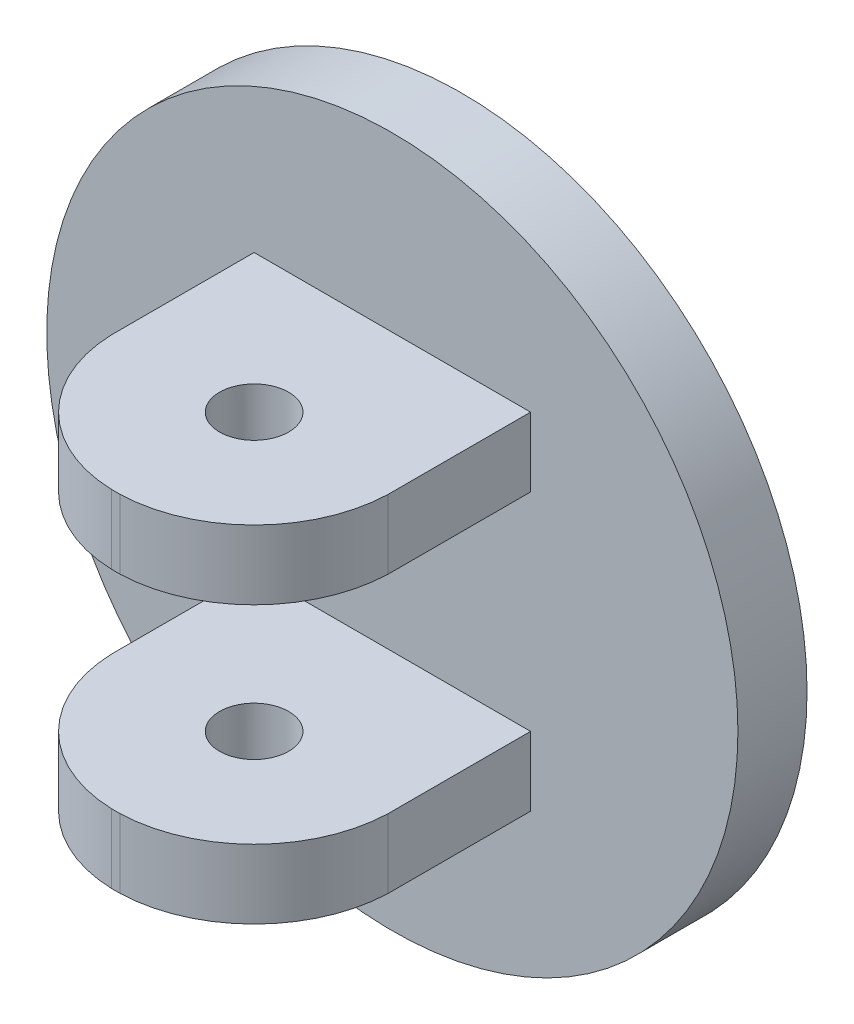
ISO-10303-21;
HEADER;
FILE_DESCRIPTION(('STEP AP214'),'2;1');
FILE_NAME('part.step','',(''),(''),'','','');
FILE_SCHEMA(('AUTOMOTIVE_DESIGN { 1 0 10303 214 1 1 1 1 }'));
ENDSEC;
DATA;
#1=APPLICATION_CONTEXT('core data for automotive mechanical design processes');
#2=APPLICATION_PROTOCOL_DEFINITION('international standard','automotive_design',2000,#1);
#3=PRODUCT_CONTEXT('',#1,'mechanical');
#4=PRODUCT('Part','Part','',(#3));
#5=PRODUCT_RELATED_PRODUCT_CATEGORY('part','',(#4));
#6=PRODUCT_DEFINITION_FORMATION('','',#4);
#7=PRODUCT_DEFINITION_CONTEXT('part definition',#1,'design');
#8=PRODUCT_DEFINITION('design','',#6,#7);
#9=PRODUCT_DEFINITION_SHAPE('','',#8);
#10=(LENGTH_UNIT() NAMED_UNIT(*) SI_UNIT(.MILLI.,.METRE.));
#11=(NAMED_UNIT(*) PLANE_ANGLE_UNIT() SI_UNIT($,.RADIAN.));
#12=(NAMED_UNIT(*) SI_UNIT($,.STERADIAN.) SOLID_ANGLE_UNIT());
#13=UNCERTAINTY_MEASURE_WITH_UNIT(LENGTH_MEASURE(1.E-05),#10,'distance_accuracy_value','');
#14=(GEOMETRIC_REPRESENTATION_CONTEXT(3) GLOBAL_UNCERTAINTY_ASSIGNED_CONTEXT((#13)) GLOBAL_UNIT_ASSIGNED_CONTEXT((#10,
#11,#12)) REPRESENTATION_CONTEXT('',''));
#15=CARTESIAN_POINT('',(0.,0.,0.));
#16=DIRECTION('',(0.,0.,1.));
#17=DIRECTION('',(1.,0.,0.));
#18=AXIS2_PLACEMENT_3D('',#15,#16,#17);
#19=CARTESIAN_POINT('',(20.,15.,50.));
#20=DIRECTION('',(-1.,0.,0.));
#21=DIRECTION('',(0.,0.,1.));
#22=AXIS2_PLACEMENT_3D('',#19,#20,#21);
#23=PLANE('',#22);
#24=DIRECTION('',(0.,1.,0.));
#25=VECTOR('',#24,1.);
#26=CARTESIAN_POINT('',(20.,15.,10.));
#27=LINE('',#26,#25);
#28=CARTESIAN_POINT('',(20.,15.,10.));
#29=VERTEX_POINT('',#28);
#30=CARTESIAN_POINT('',(20.,25.,10.));
#31=VERTEX_POINT('',#30);
#32=EDGE_CURVE('E164',#29,#31,#27,.T.);
#33=ORIENTED_EDGE('',*,*,#32,.T.);
#34=DIRECTION('',(0.,0.,-1.));
#35=VECTOR('',#34,1.);
#36=CARTESIAN_POINT('',(20.,25.,50.));
#37=LINE('',#36,#35);
#38=CARTESIAN_POINT('',(20.,25.,30.622391971047));
#39=VERTEX_POINT('',#38);
#40=EDGE_CURVE('E202',#39,#31,#37,.T.);
#41=ORIENTED_EDGE('',*,*,#40,.F.);
#42=DIRECTION('',(0.,1.,0.));
#43=VECTOR('',#42,1.);
#44=CARTESIAN_POINT('',(20.,-76.,30.622391971047));
#45=LINE('',#44,#43);
#46=CARTESIAN_POINT('',(20.,15.,30.622391971047));
#47=VERTEX_POINT('',#46);
#48=EDGE_CURVE('E246',#47,#39,#45,.T.);
#49=ORIENTED_EDGE('',*,*,#48,.F.);
#50=DIRECTION('',(0.,0.,-1.));
#51=VECTOR('',#50,1.);
#52=CARTESIAN_POINT('',(20.,15.,50.));
#53=LINE('',#52,#51);
#54=EDGE_CURVE('E179',#47,#29,#53,.T.);
#55=ORIENTED_EDGE('',*,*,#54,.T.);
#56=EDGE_LOOP('',(#33,#41,#49,#55));
#57=FACE_BOUND('',#56,.T.);
#58=ADVANCED_FACE('F39',(#57),#23,.F.);
#59=CARTESIAN_POINT('',(0.,25.,50.));
#60=DIRECTION('',(0.,-1.,0.));
#61=DIRECTION('',(1.,0.,0.));
#62=AXIS2_PLACEMENT_3D('',#59,#60,#61);
#63=PLANE('',#62);
#64=CARTESIAN_POINT('',(0.,25.,30.));
#65=DIRECTION('',(0.,-1.,0.));
#66=DIRECTION('',(1.,0.,0.));
#67=AXIS2_PLACEMENT_3D('',#64,#65,#66);
#68=CIRCLE('',#67,5.);
#69=CARTESIAN_POINT('',(5.,25.,30.));
#70=VERTEX_POINT('',#69);
#71=EDGE_CURVE('E259',#70,#70,#68,.F.);
#72=ORIENTED_EDGE('',*,*,#71,.F.);
#73=EDGE_LOOP('',(#72));
#74=FACE_BOUND('',#73,.T.);
#75=CARTESIAN_POINT('',(0.,25.,30.));
#76=DIRECTION('',(0.,-1.,0.));
#77=DIRECTION('',(1.,0.,0.));
#78=AXIS2_PLACEMENT_3D('',#75,#76,#77);
#79=CIRCLE('',#78,20.0096819506364);
#80=CARTESIAN_POINT('',(0.622391971046764,25.,50.));
#81=VERTEX_POINT('',#80);
#82=EDGE_CURVE('E63',#39,#81,#79,.T.);
#83=ORIENTED_EDGE('',*,*,#82,.F.);
#84=ORIENTED_EDGE('',*,*,#40,.T.);
#85=DIRECTION('',(-1.,0.,0.));
#86=VECTOR('',#85,1.);
#87=CARTESIAN_POINT('',(0.,25.,10.));
#88=LINE('',#87,#86);
#89=CARTESIAN_POINT('',(-20.,25.,10.));
#90=VERTEX_POINT('',#89);
#91=EDGE_CURVE('E183',#31,#90,#88,.T.);
#92=ORIENTED_EDGE('',*,*,#91,.T.);
#93=DIRECTION('',(0.,0.,-1.));
#94=VECTOR('',#93,1.);
#95=CARTESIAN_POINT('',(-20.,25.,50.));
#96=LINE('',#95,#94);
#97=CARTESIAN_POINT('',(-20.,25.,30.622391971047));
#98=VERTEX_POINT('',#97);
#99=EDGE_CURVE('E199',#98,#90,#96,.T.);
#100=ORIENTED_EDGE('',*,*,#99,.F.);
#101=CARTESIAN_POINT('',(-0.622391971046741,25.,50.));
#102=VERTEX_POINT('',#101);
#103=EDGE_CURVE('E217',#102,#98,#79,.T.);
#104=ORIENTED_EDGE('',*,*,#103,.F.);
#105=DIRECTION('',(-1.,0.,0.));
#106=VECTOR('',#105,1.);
#107=CARTESIAN_POINT('',(0.,25.,50.));
#108=LINE('',#107,#106);
#109=EDGE_CURVE('E170',#81,#102,#108,.T.);
#110=ORIENTED_EDGE('',*,*,#109,.F.);
#111=EDGE_LOOP('',(#83,#84,#92,#100,#104,#110));
#112=FACE_BOUND('',#111,.T.);
#113=ADVANCED_FACE('F299',(#74,#112),#63,.F.);
#114=CARTESIAN_POINT('',(-20.,15.,50.));
#115=DIRECTION('',(1.,0.,0.));
#116=DIRECTION('',(0.,0.,-1.));
#117=AXIS2_PLACEMENT_3D('',#114,#115,#116);
#118=PLANE('',#117);
#119=DIRECTION('',(0.,1.,0.));
#120=VECTOR('',#119,1.);
#121=CARTESIAN_POINT('',(-20.,-76.,30.622391971047));
#122=LINE('',#121,#120);
#123=CARTESIAN_POINT('',(-20.,15.,30.622391971047));
#124=VERTEX_POINT('',#123);
#125=EDGE_CURVE('E139',#124,#98,#122,.T.);
#126=ORIENTED_EDGE('',*,*,#125,.T.);
#127=ORIENTED_EDGE('',*,*,#99,.T.);
#128=DIRECTION('',(0.,-1.,0.));
#129=VECTOR('',#128,1.);
#130=CARTESIAN_POINT('',(-20.,15.,10.));
#131=LINE('',#130,#129);
#132=CARTESIAN_POINT('',(-20.,15.,10.));
#133=VERTEX_POINT('',#132);
#134=EDGE_CURVE('E187',#90,#133,#131,.T.);
#135=ORIENTED_EDGE('',*,*,#134,.T.);
#136=DIRECTION('',(0.,0.,-1.));
#137=VECTOR('',#136,1.);
#138=CARTESIAN_POINT('',(-20.,15.,50.));
#139=LINE('',#138,#137);
#140=EDGE_CURVE('E196',#124,#133,#139,.T.);
#141=ORIENTED_EDGE('',*,*,#140,.F.);
#142=EDGE_LOOP('',(#126,#127,#135,#141));
#143=FACE_BOUND('',#142,.T.);
#144=ADVANCED_FACE('F305',(#143),#118,.F.);
#145=CARTESIAN_POINT('',(0.,15.,50.));
#146=DIRECTION('',(0.,1.,0.));
#147=DIRECTION('',(0.,0.,1.));
#148=AXIS2_PLACEMENT_3D('',#145,#146,#147);
#149=PLANE('',#148);
#150=CARTESIAN_POINT('',(0.,15.,30.));
#151=DIRECTION('',(0.,1.,0.));
#152=DIRECTION('',(0.,0.,1.));
#153=AXIS2_PLACEMENT_3D('',#150,#151,#152);
#154=CIRCLE('',#153,5.);
#155=CARTESIAN_POINT('',(0.,15.,35.));
#156=VERTEX_POINT('',#155);
#157=EDGE_CURVE('E255',#156,#156,#154,.F.);
#158=ORIENTED_EDGE('',*,*,#157,.F.);
#159=EDGE_LOOP('',(#158));
#160=FACE_BOUND('',#159,.T.);
#161=CARTESIAN_POINT('',(0.,15.,30.));
#162=DIRECTION('',(0.,1.,0.));
#163=DIRECTION('',(0.,0.,1.));
#164=AXIS2_PLACEMENT_3D('',#161,#162,#163);
#165=CIRCLE('',#164,20.0096819506364);
#166=CARTESIAN_POINT('',(0.622391971046764,15.,50.));
#167=VERTEX_POINT('',#166);
#168=EDGE_CURVE('E241',#167,#47,#165,.T.);
#169=ORIENTED_EDGE('',*,*,#168,.F.);
#170=DIRECTION('',(1.,0.,0.));
#171=VECTOR('',#170,1.);
#172=CARTESIAN_POINT('',(0.,15.,50.));
#173=LINE('',#172,#171);
#174=CARTESIAN_POINT('',(-0.622391971046741,15.,50.));
#175=VERTEX_POINT('',#174);
#176=EDGE_CURVE('E174',#175,#167,#173,.T.);
#177=ORIENTED_EDGE('',*,*,#176,.F.);
#178=EDGE_CURVE('E55',#124,#175,#165,.T.);
#179=ORIENTED_EDGE('',*,*,#178,.F.);
#180=ORIENTED_EDGE('',*,*,#140,.T.);
#181=DIRECTION('',(1.,0.,0.));
#182=VECTOR('',#181,1.);
#183=CARTESIAN_POINT('',(0.,15.,10.));
#184=LINE('',#183,#182);
#185=EDGE_CURVE('E175',#133,#29,#184,.T.);
#186=ORIENTED_EDGE('',*,*,#185,.T.);
#187=ORIENTED_EDGE('',*,*,#54,.F.);
#188=EDGE_LOOP('',(#169,#177,#179,#180,#186,#187));
#189=FACE_BOUND('',#188,.T.);
#190=ADVANCED_FACE('F341',(#160,#189),#149,.F.);
#191=CARTESIAN_POINT('',(0.,0.,50.));
#192=DIRECTION('',(0.,0.,-1.));
#193=DIRECTION('',(-1.,0.,0.));
#194=AXIS2_PLACEMENT_3D('',#191,#192,#193);
#195=PLANE('',#194);
#196=DIRECTION('',(0.,1.,0.));
#197=VECTOR('',#196,1.);
#198=CARTESIAN_POINT('',(-0.622391971046741,-76.,50.));
#199=LINE('',#198,#197);
#200=EDGE_CURVE('E249',#175,#102,#199,.T.);
#201=ORIENTED_EDGE('',*,*,#200,.F.);
#202=ORIENTED_EDGE('',*,*,#176,.T.);
#203=DIRECTION('',(0.,1.,0.));
#204=VECTOR('',#203,1.);
#205=CARTESIAN_POINT('',(0.622391971046764,-76.,50.));
#206=LINE('',#205,#204);
#207=EDGE_CURVE('E237',#81,#167,#206,.F.);
#208=ORIENTED_EDGE('',*,*,#207,.F.);
#209=ORIENTED_EDGE('',*,*,#109,.T.);
#210=EDGE_LOOP('',(#201,#202,#208,#209));
#211=FACE_BOUND('',#210,.T.);
#212=ADVANCED_FACE('F350',(#211),#195,.F.);
#213=CARTESIAN_POINT('',(-20.,-15.,50.));
#214=DIRECTION('',(1.,0.,0.));
#215=DIRECTION('',(0.,0.,-1.));
#216=AXIS2_PLACEMENT_3D('',#213,#214,#215);
#217=PLANE('',#216);
#218=CARTESIAN_POINT('',(-20.,-25.,30.622391971047));
#219=VERTEX_POINT('',#218);
#220=CARTESIAN_POINT('',(-20.,-15.,30.622391971047));
#221=VERTEX_POINT('',#220);
#222=EDGE_CURVE('E128',#219,#221,#122,.T.);
#223=ORIENTED_EDGE('',*,*,#222,.T.);
#224=DIRECTION('',(0.,0.,-1.));
#225=VECTOR('',#224,1.);
#226=CARTESIAN_POINT('',(-20.,-15.,50.));
#227=LINE('',#226,#225);
#228=CARTESIAN_POINT('',(-20.,-15.,10.));
#229=VERTEX_POINT('',#228);
#230=EDGE_CURVE('E159',#221,#229,#227,.T.);
#231=ORIENTED_EDGE('',*,*,#230,.T.);
#232=DIRECTION('',(0.,-1.,0.));
#233=VECTOR('',#232,1.);
#234=CARTESIAN_POINT('',(-20.,-15.,10.));
#235=LINE('',#234,#233);
#236=CARTESIAN_POINT('',(-20.,-25.,10.));
#237=VERTEX_POINT('',#236);
#238=EDGE_CURVE('E156',#229,#237,#235,.T.);
#239=ORIENTED_EDGE('',*,*,#238,.T.);
#240=DIRECTION('',(0.,0.,-1.));
#241=VECTOR('',#240,1.);
#242=CARTESIAN_POINT('',(-20.,-25.,50.));
#243=LINE('',#242,#241);
#244=EDGE_CURVE('E146',#219,#237,#243,.T.);
#245=ORIENTED_EDGE('',*,*,#244,.F.);
#246=EDGE_LOOP('',(#223,#231,#239,#245));
#247=FACE_BOUND('',#246,.T.);
#248=ADVANCED_FACE('F154',(#247),#217,.F.);
#249=CARTESIAN_POINT('',(0.,-25.,50.));
#250=DIRECTION('',(0.,1.,0.));
#251=DIRECTION('',(0.,0.,1.));
#252=AXIS2_PLACEMENT_3D('',#249,#250,#251);
#253=PLANE('',#252);
#254=CARTESIAN_POINT('',(0.,-25.,30.));
#255=DIRECTION('',(0.,1.,0.));
#256=DIRECTION('',(0.,0.,1.));
#257=AXIS2_PLACEMENT_3D('',#254,#255,#256);
#258=CIRCLE('',#257,5.);
#259=CARTESIAN_POINT('',(0.,-25.,35.));
#260=VERTEX_POINT('',#259);
#261=EDGE_CURVE('E216',#260,#260,#258,.F.);
#262=ORIENTED_EDGE('',*,*,#261,.F.);
#263=EDGE_LOOP('',(#262));
#264=FACE_BOUND('',#263,.T.);
#265=CARTESIAN_POINT('',(0.,-25.,30.));
#266=DIRECTION('',(0.,1.,0.));
#267=DIRECTION('',(0.,0.,1.));
#268=AXIS2_PLACEMENT_3D('',#265,#266,#267);
#269=CIRCLE('',#268,20.0096819506364);
#270=CARTESIAN_POINT('',(0.622391971046764,-25.,50.));
#271=VERTEX_POINT('',#270);
#272=CARTESIAN_POINT('',(20.,-25.,30.622391971047));
#273=VERTEX_POINT('',#272);
#274=EDGE_CURVE('E153',#271,#273,#269,.T.);
#275=ORIENTED_EDGE('',*,*,#274,.F.);
#276=DIRECTION('',(1.,0.,0.));
#277=VECTOR('',#276,1.);
#278=CARTESIAN_POINT('',(0.,-25.,50.));
#279=LINE('',#278,#277);
#280=CARTESIAN_POINT('',(-0.622391971046741,-25.,50.));
#281=VERTEX_POINT('',#280);
#282=EDGE_CURVE('E149',#281,#271,#279,.T.);
#283=ORIENTED_EDGE('',*,*,#282,.F.);
#284=EDGE_CURVE('E131',#219,#281,#269,.T.);
#285=ORIENTED_EDGE('',*,*,#284,.F.);
#286=ORIENTED_EDGE('',*,*,#244,.T.);
#287=DIRECTION('',(1.,0.,0.));
#288=VECTOR('',#287,1.);
#289=CARTESIAN_POINT('',(0.,-25.,10.));
#290=LINE('',#289,#288);
#291=CARTESIAN_POINT('',(20.,-25.,10.));
#292=VERTEX_POINT('',#291);
#293=EDGE_CURVE('E270',#237,#292,#290,.T.);
#294=ORIENTED_EDGE('',*,*,#293,.T.);
#295=DIRECTION('',(0.,0.,-1.));
#296=VECTOR('',#295,1.);
#297=CARTESIAN_POINT('',(20.,-25.,50.));
#298=LINE('',#297,#296);
#299=EDGE_CURVE('E160',#273,#292,#298,.T.);
#300=ORIENTED_EDGE('',*,*,#299,.F.);
#301=EDGE_LOOP('',(#275,#283,#285,#286,#294,#300));
#302=FACE_BOUND('',#301,.T.);
#303=ADVANCED_FACE('F144',(#264,#302),#253,.F.);
#304=CARTESIAN_POINT('',(20.,-15.,50.));
#305=DIRECTION('',(-1.,0.,0.));
#306=DIRECTION('',(0.,0.,1.));
#307=AXIS2_PLACEMENT_3D('',#304,#305,#306);
#308=PLANE('',#307);
#309=DIRECTION('',(0.,1.,0.));
#310=VECTOR('',#309,1.);
#311=CARTESIAN_POINT('',(20.,-15.,10.));
#312=LINE('',#311,#310);
#313=CARTESIAN_POINT('',(20.,-15.,10.));
#314=VERTEX_POINT('',#313);
#315=EDGE_CURVE('E273',#292,#314,#312,.T.);
#316=ORIENTED_EDGE('',*,*,#315,.T.);
#317=DIRECTION('',(0.,0.,-1.));
#318=VECTOR('',#317,1.);
#319=CARTESIAN_POINT('',(20.,-15.,50.));
#320=LINE('',#319,#318);
#321=CARTESIAN_POINT('',(20.,-15.,30.622391971047));
#322=VERTEX_POINT('',#321);
#323=EDGE_CURVE('E166',#322,#314,#320,.T.);
#324=ORIENTED_EDGE('',*,*,#323,.F.);
#325=DIRECTION('',(0.,1.,0.));
#326=VECTOR('',#325,1.);
#327=CARTESIAN_POINT('',(20.,-76.,30.622391971047));
#328=LINE('',#327,#326);
#329=EDGE_CURVE('E231',#273,#322,#328,.T.);
#330=ORIENTED_EDGE('',*,*,#329,.F.);
#331=ORIENTED_EDGE('',*,*,#299,.T.);
#332=EDGE_LOOP('',(#316,#324,#330,#331));
#333=FACE_BOUND('',#332,.T.);
#334=ADVANCED_FACE('F283',(#333),#308,.F.);
#335=CARTESIAN_POINT('',(0.,-15.,50.));
#336=DIRECTION('',(0.,-1.,0.));
#337=DIRECTION('',(0.,0.,-1.));
#338=AXIS2_PLACEMENT_3D('',#335,#336,#337);
#339=PLANE('',#338);
#340=CARTESIAN_POINT('',(0.,-15.,30.));
#341=DIRECTION('',(0.,-1.,0.));
#342=DIRECTION('',(0.,0.,-1.));
#343=AXIS2_PLACEMENT_3D('',#340,#341,#342);
#344=CIRCLE('',#343,5.);
#345=CARTESIAN_POINT('',(0.,-15.,25.));
#346=VERTEX_POINT('',#345);
#347=EDGE_CURVE('E213',#346,#346,#344,.F.);
#348=ORIENTED_EDGE('',*,*,#347,.F.);
#349=EDGE_LOOP('',(#348));
#350=FACE_BOUND('',#349,.T.);
#351=CARTESIAN_POINT('',(0.,-15.,30.));
#352=DIRECTION('',(0.,-1.,0.));
#353=DIRECTION('',(0.,0.,-1.));
#354=AXIS2_PLACEMENT_3D('',#351,#352,#353);
#355=CIRCLE('',#354,20.0096819506364);
#356=CARTESIAN_POINT('',(0.622391971046764,-15.,50.));
#357=VERTEX_POINT('',#356);
#358=EDGE_CURVE('E151',#322,#357,#355,.T.);
#359=ORIENTED_EDGE('',*,*,#358,.F.);
#360=ORIENTED_EDGE('',*,*,#323,.T.);
#361=DIRECTION('',(-1.,0.,0.));
#362=VECTOR('',#361,1.);
#363=CARTESIAN_POINT('',(0.,-15.,10.));
#364=LINE('',#363,#362);
#365=EDGE_CURVE('E265',#314,#229,#364,.T.);
#366=ORIENTED_EDGE('',*,*,#365,.T.);
#367=ORIENTED_EDGE('',*,*,#230,.F.);
#368=CARTESIAN_POINT('',(-0.622391971046741,-15.,50.));
#369=VERTEX_POINT('',#368);
#370=EDGE_CURVE('E134',#369,#221,#355,.T.);
#371=ORIENTED_EDGE('',*,*,#370,.F.);
#372=DIRECTION('',(-1.,0.,0.));
#373=VECTOR('',#372,1.);
#374=CARTESIAN_POINT('',(0.,-15.,50.));
#375=LINE('',#374,#373);
#376=EDGE_CURVE('E223',#357,#369,#375,.T.);
#377=ORIENTED_EDGE('',*,*,#376,.F.);
#378=EDGE_LOOP('',(#359,#360,#366,#367,#371,#377));
#379=FACE_BOUND('',#378,.T.);
#380=ADVANCED_FACE('F226',(#350,#379),#339,.F.);
#381=CARTESIAN_POINT('',(0.,0.,50.));
#382=DIRECTION('',(0.,0.,1.));
#383=DIRECTION('',(1.,0.,0.));
#384=AXIS2_PLACEMENT_3D('',#381,#382,#383);
#385=PLANE('',#384);
#386=ORIENTED_EDGE('',*,*,#282,.T.);
#387=DIRECTION('',(0.,1.,0.));
#388=VECTOR('',#387,1.);
#389=CARTESIAN_POINT('',(0.622391971046764,-76.,50.));
#390=LINE('',#389,#388);
#391=EDGE_CURVE('E11',#271,#357,#390,.T.);
#392=ORIENTED_EDGE('',*,*,#391,.T.);
#393=ORIENTED_EDGE('',*,*,#376,.T.);
#394=DIRECTION('',(0.,1.,0.));
#395=VECTOR('',#394,1.);
#396=CARTESIAN_POINT('',(-0.622391971046741,-76.,50.));
#397=LINE('',#396,#395);
#398=EDGE_CURVE('E48',#369,#281,#397,.F.);
#399=ORIENTED_EDGE('',*,*,#398,.T.);
#400=EDGE_LOOP('',(#386,#392,#393,#399));
#401=FACE_BOUND('',#400,.T.);
#402=ADVANCED_FACE('F221',(#401),#385,.T.);
#403=CARTESIAN_POINT('',(0.,0.,10.));
#404=DIRECTION('',(0.,0.,1.));
#405=DIRECTION('',(1.,0.,0.));
#406=AXIS2_PLACEMENT_3D('',#403,#404,#405);
#407=PLANE('',#406);
#408=CARTESIAN_POINT('',(0.,0.,10.));
#409=DIRECTION('',(0.,0.,1.));
#410=DIRECTION('',(1.,0.,0.));
#411=AXIS2_PLACEMENT_3D('',#408,#409,#410);
#412=CIRCLE('',#411,50.);
#413=CARTESIAN_POINT('',(50.,0.,10.));
#414=VERTEX_POINT('',#413);
#415=EDGE_CURVE('E206',#414,#414,#412,.T.);
#416=ORIENTED_EDGE('',*,*,#415,.T.);
#417=EDGE_LOOP('',(#416));
#418=FACE_BOUND('',#417,.T.);
#419=ORIENTED_EDGE('',*,*,#91,.F.);
#420=ORIENTED_EDGE('',*,*,#32,.F.);
#421=ORIENTED_EDGE('',*,*,#185,.F.);
#422=ORIENTED_EDGE('',*,*,#134,.F.);
#423=EDGE_LOOP('',(#419,#420,#421,#422));
#424=FACE_BOUND('',#423,.T.);
#425=ORIENTED_EDGE('',*,*,#293,.F.);
#426=ORIENTED_EDGE('',*,*,#238,.F.);
#427=ORIENTED_EDGE('',*,*,#365,.F.);
#428=ORIENTED_EDGE('',*,*,#315,.F.);
#429=EDGE_LOOP('',(#425,#426,#427,#428));
#430=FACE_BOUND('',#429,.T.);
#431=ADVANCED_FACE('F286',(#418,#424,#430),#407,.T.);
#432=CARTESIAN_POINT('',(0.,0.,10.));
#433=DIRECTION('',(0.,0.,-1.));
#434=DIRECTION('',(-1.,0.,0.));
#435=AXIS2_PLACEMENT_3D('',#432,#433,#434);
#436=CYLINDRICAL_SURFACE('',#435,50.);
#437=ORIENTED_EDGE('',*,*,#415,.F.);
#438=EDGE_LOOP('',(#437));
#439=FACE_BOUND('',#438,.T.);
#440=CARTESIAN_POINT('',(0.,0.,0.));
#441=DIRECTION('',(0.,0.,1.));
#442=DIRECTION('',(1.,0.,0.));
#443=AXIS2_PLACEMENT_3D('',#440,#441,#442);
#444=CIRCLE('',#443,50.);
#445=CARTESIAN_POINT('',(50.,0.,0.));
#446=VERTEX_POINT('',#445);
#447=EDGE_CURVE('E205',#446,#446,#444,.T.);
#448=ORIENTED_EDGE('',*,*,#447,.T.);
#449=EDGE_LOOP('',(#448));
#450=FACE_BOUND('',#449,.T.);
#451=ADVANCED_FACE('F41',(#439,#450),#436,.T.);
#452=CARTESIAN_POINT('',(0.,0.,0.));
#453=DIRECTION('',(0.,0.,1.));
#454=DIRECTION('',(1.,0.,0.));
#455=AXIS2_PLACEMENT_3D('',#452,#453,#454);
#456=PLANE('',#455);
#457=ORIENTED_EDGE('',*,*,#447,.F.);
#458=EDGE_LOOP('',(#457));
#459=FACE_BOUND('',#458,.T.);
#460=ADVANCED_FACE('F312',(#459),#456,.F.);
#461=CARTESIAN_POINT('',(0.,35.,30.));
#462=DIRECTION('',(0.,-1.,0.));
#463=DIRECTION('',(1.,0.,0.));
#464=AXIS2_PLACEMENT_3D('',#461,#462,#463);
#465=CYLINDRICAL_SURFACE('',#464,5.);
#466=ORIENTED_EDGE('',*,*,#347,.T.);
#467=EDGE_LOOP('',(#466));
#468=FACE_BOUND('',#467,.T.);
#469=ORIENTED_EDGE('',*,*,#261,.T.);
#470=EDGE_LOOP('',(#469));
#471=FACE_BOUND('',#470,.T.);
#472=ADVANCED_FACE('F314',(#468,#471),#465,.F.);
#473=ORIENTED_EDGE('',*,*,#157,.T.);
#474=EDGE_LOOP('',(#473));
#475=FACE_BOUND('',#474,.T.);
#476=ORIENTED_EDGE('',*,*,#71,.T.);
#477=EDGE_LOOP('',(#476));
#478=FACE_BOUND('',#477,.T.);
#479=ADVANCED_FACE('F296',(#475,#478),#465,.F.);
#480=CARTESIAN_POINT('',(0.,-76.,30.));
#481=DIRECTION('',(0.,1.,0.));
#482=DIRECTION('',(0.,0.,1.));
#483=AXIS2_PLACEMENT_3D('',#480,#481,#482);
#484=CYLINDRICAL_SURFACE('',#483,20.0096819506364);
#485=ORIENTED_EDGE('',*,*,#284,.T.);
#486=ORIENTED_EDGE('',*,*,#398,.F.);
#487=ORIENTED_EDGE('',*,*,#370,.T.);
#488=ORIENTED_EDGE('',*,*,#222,.F.);
#489=EDGE_LOOP('',(#485,#486,#487,#488));
#490=FACE_BOUND('',#489,.T.);
#491=ADVANCED_FACE('F130',(#490),#484,.T.);
#492=ORIENTED_EDGE('',*,*,#274,.T.);
#493=ORIENTED_EDGE('',*,*,#329,.T.);
#494=ORIENTED_EDGE('',*,*,#358,.T.);
#495=ORIENTED_EDGE('',*,*,#391,.F.);
#496=EDGE_LOOP('',(#492,#493,#494,#495));
#497=FACE_BOUND('',#496,.T.);
#498=ADVANCED_FACE('F287',(#497),#484,.T.);
#499=ORIENTED_EDGE('',*,*,#48,.T.);
#500=ORIENTED_EDGE('',*,*,#82,.T.);
#501=ORIENTED_EDGE('',*,*,#207,.T.);
#502=ORIENTED_EDGE('',*,*,#168,.T.);
#503=EDGE_LOOP('',(#499,#500,#501,#502));
#504=FACE_BOUND('',#503,.T.);
#505=ADVANCED_FACE('F289',(#504),#484,.T.);
#506=ORIENTED_EDGE('',*,*,#103,.T.);
#507=ORIENTED_EDGE('',*,*,#125,.F.);
#508=ORIENTED_EDGE('',*,*,#178,.T.);
#509=ORIENTED_EDGE('',*,*,#200,.T.);
#510=EDGE_LOOP('',(#506,#507,#508,#509));
#511=FACE_BOUND('',#510,.T.);
#512=ADVANCED_FACE('F295',(#511),#484,.T.);
#513=CLOSED_SHELL('',(#58,#113,#144,#190,#212,#248,#303,#334,#380,#402,#431,#451,#460,#472,#479,
#491,#498,#505,#512));
#514=MANIFOLD_SOLID_BREP('B2',#513);
#515=ADVANCED_BREP_SHAPE_REPRESENTATION('',(#18,#514),#14);
#516=SHAPE_DEFINITION_REPRESENTATION(#9,#515);
ENDSEC;
END-ISO-10303-21;
